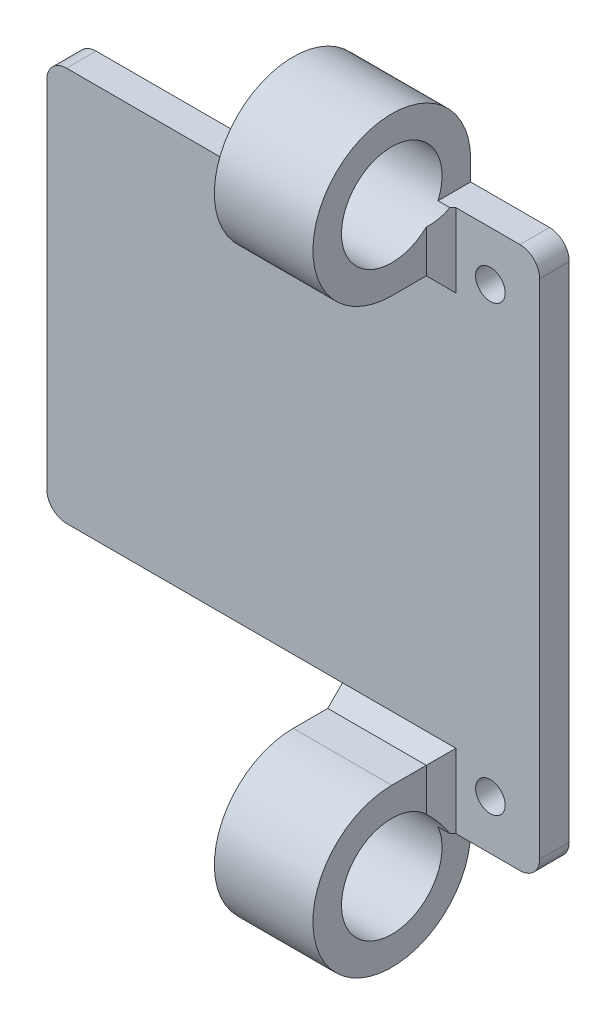
ISO-10303-21;
HEADER;
FILE_DESCRIPTION(('STEP AP214'),'2;1');
FILE_NAME('part.step','',(''),(''),'','','');
FILE_SCHEMA(('AUTOMOTIVE_DESIGN { 1 0 10303 214 1 1 1 1 }'));
ENDSEC;
DATA;
#1=APPLICATION_CONTEXT('core data for automotive mechanical design processes');
#2=APPLICATION_PROTOCOL_DEFINITION('international standard','automotive_design',2000,#1);
#3=PRODUCT_CONTEXT('',#1,'mechanical');
#4=PRODUCT('Part','Part','',(#3));
#5=PRODUCT_RELATED_PRODUCT_CATEGORY('part','',(#4));
#6=PRODUCT_DEFINITION_FORMATION('','',#4);
#7=PRODUCT_DEFINITION_CONTEXT('part definition',#1,'design');
#8=PRODUCT_DEFINITION('design','',#6,#7);
#9=PRODUCT_DEFINITION_SHAPE('','',#8);
#10=(LENGTH_UNIT() NAMED_UNIT(*) SI_UNIT(.MILLI.,.METRE.));
#11=(NAMED_UNIT(*) PLANE_ANGLE_UNIT() SI_UNIT($,.RADIAN.));
#12=(NAMED_UNIT(*) SI_UNIT($,.STERADIAN.) SOLID_ANGLE_UNIT());
#13=UNCERTAINTY_MEASURE_WITH_UNIT(LENGTH_MEASURE(1.E-05),#10,'distance_accuracy_value','');
#14=(GEOMETRIC_REPRESENTATION_CONTEXT(3) GLOBAL_UNCERTAINTY_ASSIGNED_CONTEXT((#13)) GLOBAL_UNIT_ASSIGNED_CONTEXT((#10,
#11,#12)) REPRESENTATION_CONTEXT('',''));
#15=CARTESIAN_POINT('',(0.,0.,0.));
#16=DIRECTION('',(0.,0.,1.));
#17=DIRECTION('',(1.,0.,0.));
#18=AXIS2_PLACEMENT_3D('',#15,#16,#17);
#19=CARTESIAN_POINT('',(-4.99999999999998,27.5,3.));
#20=DIRECTION('',(0.,-1.,0.));
#21=DIRECTION('',(1.,0.,0.));
#22=AXIS2_PLACEMENT_3D('',#19,#20,#21);
#23=PLANE('',#22);
#24=DIRECTION('',(-1.,0.,0.));
#25=VECTOR('',#24,1.);
#26=CARTESIAN_POINT('',(-4.99999999999998,27.5,0.));
#27=LINE('',#26,#25);
#28=CARTESIAN_POINT('',(5.,27.5,0.));
#29=VERTEX_POINT('',#28);
#30=CARTESIAN_POINT('',(-2.99999999999996,27.5,0.));
#31=VERTEX_POINT('',#30);
#32=EDGE_CURVE('E326',#29,#31,#27,.T.);
#33=ORIENTED_EDGE('',*,*,#32,.T.);
#34=DIRECTION('',(0.,0.,1.));
#35=VECTOR('',#34,1.);
#36=CARTESIAN_POINT('',(-2.99999999999996,27.5,3.));
#37=LINE('',#36,#35);
#38=CARTESIAN_POINT('',(-2.99999999999996,27.5,3.));
#39=VERTEX_POINT('',#38);
#40=EDGE_CURVE('E398',#31,#39,#37,.T.);
#41=ORIENTED_EDGE('',*,*,#40,.T.);
#42=DIRECTION('',(-1.,0.,0.));
#43=VECTOR('',#42,1.);
#44=CARTESIAN_POINT('',(-4.99999999999998,27.5,3.));
#45=LINE('',#44,#43);
#46=CARTESIAN_POINT('',(3.49999999999998,27.5,3.));
#47=VERTEX_POINT('',#46);
#48=EDGE_CURVE('E305',#47,#39,#45,.T.);
#49=ORIENTED_EDGE('',*,*,#48,.F.);
#50=DIRECTION('',(-0.707106781186551,0.,-0.707106781186544));
#51=VECTOR('',#50,1.);
#52=CARTESIAN_POINT('',(-0.750000000000036,27.5,-1.24999999999998));
#53=LINE('',#52,#51);
#54=CARTESIAN_POINT('',(3.80851835770403,27.5,3.30851835770404));
#55=VERTEX_POINT('',#54);
#56=EDGE_CURVE('E57',#47,#55,#53,.F.);
#57=ORIENTED_EDGE('',*,*,#56,.T.);
#58=DIRECTION('',(-1.,0.,0.));
#59=VECTOR('',#58,1.);
#60=CARTESIAN_POINT('',(5.,27.5,3.30851835770404));
#61=LINE('',#60,#59);
#62=CARTESIAN_POINT('',(5.,27.5,3.30851835770404));
#63=VERTEX_POINT('',#62);
#64=EDGE_CURVE('E42',#63,#55,#61,.T.);
#65=ORIENTED_EDGE('',*,*,#64,.F.);
#66=DIRECTION('',(0.,0.,1.));
#67=VECTOR('',#66,1.);
#68=CARTESIAN_POINT('',(5.,27.5,3.));
#69=LINE('',#68,#67);
#70=EDGE_CURVE('E385',#29,#63,#69,.T.);
#71=ORIENTED_EDGE('',*,*,#70,.F.);
#72=EDGE_LOOP('',(#33,#41,#49,#57,#65,#71));
#73=FACE_BOUND('',#72,.T.);
#74=ADVANCED_FACE('F33',(#73),#23,.F.);
#75=CARTESIAN_POINT('',(-25.,-20.,3.));
#76=DIRECTION('',(0.,1.,0.));
#77=DIRECTION('',(-1.,0.,0.));
#78=AXIS2_PLACEMENT_3D('',#75,#76,#77);
#79=PLANE('',#78);
#80=DIRECTION('',(0.,0.,-1.));
#81=VECTOR('',#80,1.);
#82=CARTESIAN_POINT('',(5.,-20.,3.));
#83=LINE('',#82,#81);
#84=CARTESIAN_POINT('',(5.,-20.,3.));
#85=VERTEX_POINT('',#84);
#86=CARTESIAN_POINT('',(5.,-20.,0.));
#87=VERTEX_POINT('',#86);
#88=EDGE_CURVE('E383',#85,#87,#83,.T.);
#89=ORIENTED_EDGE('',*,*,#88,.F.);
#90=DIRECTION('',(1.,0.,0.));
#91=VECTOR('',#90,1.);
#92=CARTESIAN_POINT('',(-25.,-20.,3.));
#93=LINE('',#92,#91);
#94=CARTESIAN_POINT('',(-23.,-20.,3.));
#95=VERTEX_POINT('',#94);
#96=EDGE_CURVE('E318',#95,#85,#93,.T.);
#97=ORIENTED_EDGE('',*,*,#96,.F.);
#98=DIRECTION('',(0.,0.,-1.));
#99=VECTOR('',#98,1.);
#100=CARTESIAN_POINT('',(-23.,-20.,3.));
#101=LINE('',#100,#99);
#102=CARTESIAN_POINT('',(-23.,-20.,0.));
#103=VERTEX_POINT('',#102);
#104=EDGE_CURVE('E369',#95,#103,#101,.T.);
#105=ORIENTED_EDGE('',*,*,#104,.T.);
#106=DIRECTION('',(1.,0.,0.));
#107=VECTOR('',#106,1.);
#108=CARTESIAN_POINT('',(-25.,-20.,0.));
#109=LINE('',#108,#107);
#110=EDGE_CURVE('E337',#103,#87,#109,.T.);
#111=ORIENTED_EDGE('',*,*,#110,.T.);
#112=EDGE_LOOP('',(#89,#97,#105,#111));
#113=FACE_BOUND('',#112,.T.);
#114=ADVANCED_FACE('F502',(#113),#79,.F.);
#115=CARTESIAN_POINT('',(0.,0.,3.));
#116=DIRECTION('',(0.,0.,-1.));
#117=DIRECTION('',(-1.,0.,0.));
#118=AXIS2_PLACEMENT_3D('',#115,#116,#117);
#119=PLANE('',#118);
#120=DIRECTION('',(1.,0.,0.));
#121=VECTOR('',#120,1.);
#122=CARTESIAN_POINT('',(0.,-20.,3.));
#123=LINE('',#122,#121);
#124=CARTESIAN_POINT('',(16.5,-20.,3.));
#125=VERTEX_POINT('',#124);
#126=EDGE_CURVE('E414',#85,#125,#123,.T.);
#127=ORIENTED_EDGE('',*,*,#126,.T.);
#128=DIRECTION('',(0.,-1.,0.));
#129=VECTOR('',#128,1.);
#130=CARTESIAN_POINT('',(16.5,0.,3.));
#131=LINE('',#130,#129);
#132=CARTESIAN_POINT('',(16.5,-27.5,3.));
#133=VERTEX_POINT('',#132);
#134=EDGE_CURVE('E416',#125,#133,#131,.T.);
#135=ORIENTED_EDGE('',*,*,#134,.T.);
#136=DIRECTION('',(1.,0.,0.));
#137=VECTOR('',#136,1.);
#138=CARTESIAN_POINT('',(9.99999999999999,-27.5,3.));
#139=LINE('',#138,#137);
#140=CARTESIAN_POINT('',(23.,-27.5,3.));
#141=VERTEX_POINT('',#140);
#142=EDGE_CURVE('E321',#133,#141,#139,.T.);
#143=ORIENTED_EDGE('',*,*,#142,.T.);
#144=CARTESIAN_POINT('',(23.,-25.5,3.));
#145=DIRECTION('',(0.,0.,-1.));
#146=DIRECTION('',(-1.,0.,0.));
#147=AXIS2_PLACEMENT_3D('',#144,#145,#146);
#148=CIRCLE('',#147,2.);
#149=CARTESIAN_POINT('',(25.,-25.5,3.));
#150=VERTEX_POINT('',#149);
#151=EDGE_CURVE('E362',#141,#150,#148,.F.);
#152=ORIENTED_EDGE('',*,*,#151,.T.);
#153=DIRECTION('',(0.,1.,0.));
#154=VECTOR('',#153,1.);
#155=CARTESIAN_POINT('',(25.,-27.5,3.));
#156=LINE('',#155,#154);
#157=CARTESIAN_POINT('',(25.,25.5,3.));
#158=VERTEX_POINT('',#157);
#159=EDGE_CURVE('E302',#150,#158,#156,.T.);
#160=ORIENTED_EDGE('',*,*,#159,.T.);
#161=CARTESIAN_POINT('',(23.,25.5,3.));
#162=DIRECTION('',(0.,0.,-1.));
#163=DIRECTION('',(-1.,0.,0.));
#164=AXIS2_PLACEMENT_3D('',#161,#162,#163);
#165=CIRCLE('',#164,2.);
#166=CARTESIAN_POINT('',(23.,27.5,3.));
#167=VERTEX_POINT('',#166);
#168=EDGE_CURVE('E364',#158,#167,#165,.F.);
#169=ORIENTED_EDGE('',*,*,#168,.T.);
#170=CARTESIAN_POINT('',(16.5,27.5,3.));
#171=VERTEX_POINT('',#170);
#172=EDGE_CURVE('E307',#167,#171,#45,.T.);
#173=ORIENTED_EDGE('',*,*,#172,.T.);
#174=DIRECTION('',(0.,-1.,0.));
#175=VECTOR('',#174,1.);
#176=CARTESIAN_POINT('',(16.5,0.,3.));
#177=LINE('',#176,#175);
#178=CARTESIAN_POINT('',(16.5,20.,3.));
#179=VERTEX_POINT('',#178);
#180=EDGE_CURVE('E411',#171,#179,#177,.T.);
#181=ORIENTED_EDGE('',*,*,#180,.T.);
#182=DIRECTION('',(-1.,0.,0.));
#183=VECTOR('',#182,1.);
#184=CARTESIAN_POINT('',(5.,20.,3.));
#185=LINE('',#184,#183);
#186=CARTESIAN_POINT('',(3.49999999999998,20.,3.));
#187=VERTEX_POINT('',#186);
#188=EDGE_CURVE('E407',#179,#187,#185,.T.);
#189=ORIENTED_EDGE('',*,*,#188,.T.);
#190=DIRECTION('',(0.,1.,0.));
#191=VECTOR('',#190,1.);
#192=CARTESIAN_POINT('',(3.49999999999998,27.5,3.));
#193=LINE('',#192,#191);
#194=EDGE_CURVE('E409',#187,#47,#193,.T.);
#195=ORIENTED_EDGE('',*,*,#194,.T.);
#196=ORIENTED_EDGE('',*,*,#48,.T.);
#197=DIRECTION('',(0.70710678118655,0.707106781186545,0.));
#198=VECTOR('',#197,1.);
#199=CARTESIAN_POINT('',(-4.99999999999998,25.5,3.));
#200=LINE('',#199,#198);
#201=CARTESIAN_POINT('',(-4.99999999999998,25.5,3.));
#202=VERTEX_POINT('',#201);
#203=EDGE_CURVE('E401',#39,#202,#200,.F.);
#204=ORIENTED_EDGE('',*,*,#203,.T.);
#205=DIRECTION('',(0.,-1.,0.));
#206=VECTOR('',#205,1.);
#207=CARTESIAN_POINT('',(-4.99999999999998,27.5,3.));
#208=LINE('',#207,#206);
#209=CARTESIAN_POINT('',(-4.99999999999998,22.,3.));
#210=VERTEX_POINT('',#209);
#211=EDGE_CURVE('E310',#202,#210,#208,.T.);
#212=ORIENTED_EDGE('',*,*,#211,.T.);
#213=DIRECTION('',(0.707106781186552,0.707106781186543,0.));
#214=VECTOR('',#213,1.);
#215=CARTESIAN_POINT('',(-13.4999999999999,13.5000000000001,3.));
#216=LINE('',#215,#214);
#217=CARTESIAN_POINT('',(-6.99999999999998,20.,3.));
#218=VERTEX_POINT('',#217);
#219=EDGE_CURVE('E405',#210,#218,#216,.F.);
#220=ORIENTED_EDGE('',*,*,#219,.T.);
#221=DIRECTION('',(-1.,0.,0.));
#222=VECTOR('',#221,1.);
#223=CARTESIAN_POINT('',(-4.99999999999998,20.,3.));
#224=LINE('',#223,#222);
#225=CARTESIAN_POINT('',(-23.,20.,3.));
#226=VERTEX_POINT('',#225);
#227=EDGE_CURVE('E313',#218,#226,#224,.T.);
#228=ORIENTED_EDGE('',*,*,#227,.T.);
#229=CARTESIAN_POINT('',(-23.,18.,3.));
#230=DIRECTION('',(0.,0.,-1.));
#231=DIRECTION('',(-1.,0.,0.));
#232=AXIS2_PLACEMENT_3D('',#229,#230,#231);
#233=CIRCLE('',#232,2.);
#234=CARTESIAN_POINT('',(-25.,18.,3.));
#235=VERTEX_POINT('',#234);
#236=EDGE_CURVE('E358',#226,#235,#233,.F.);
#237=ORIENTED_EDGE('',*,*,#236,.T.);
#238=DIRECTION('',(0.,-1.,0.));
#239=VECTOR('',#238,1.);
#240=CARTESIAN_POINT('',(-25.,-20.,3.));
#241=LINE('',#240,#239);
#242=CARTESIAN_POINT('',(-25.,-18.,3.));
#243=VERTEX_POINT('',#242);
#244=EDGE_CURVE('E315',#235,#243,#241,.T.);
#245=ORIENTED_EDGE('',*,*,#244,.T.);
#246=CARTESIAN_POINT('',(-23.,-18.,3.));
#247=DIRECTION('',(0.,0.,-1.));
#248=DIRECTION('',(-1.,0.,0.));
#249=AXIS2_PLACEMENT_3D('',#246,#247,#248);
#250=CIRCLE('',#249,2.);
#251=EDGE_CURVE('E360',#243,#95,#250,.F.);
#252=ORIENTED_EDGE('',*,*,#251,.T.);
#253=ORIENTED_EDGE('',*,*,#96,.T.);
#254=EDGE_LOOP('',(#127,#135,#143,#152,#160,#169,#173,#181,#189,#195,#196,#204,#212,#220,#228,
#237,#245,#252,#253));
#255=FACE_BOUND('',#254,.T.);
#256=CARTESIAN_POINT('',(20.,-22.5,3.));
#257=DIRECTION('',(0.,0.,1.));
#258=DIRECTION('',(1.,0.,0.));
#259=AXIS2_PLACEMENT_3D('',#256,#257,#258);
#260=CIRCLE('',#259,1.5);
#261=CARTESIAN_POINT('',(21.5,-22.5,3.));
#262=VERTEX_POINT('',#261);
#263=EDGE_CURVE('E284',#262,#262,#260,.T.);
#264=ORIENTED_EDGE('',*,*,#263,.F.);
#265=EDGE_LOOP('',(#264));
#266=FACE_BOUND('',#265,.T.);
#267=CARTESIAN_POINT('',(20.,22.5,3.));
#268=DIRECTION('',(0.,0.,1.));
#269=DIRECTION('',(1.,0.,0.));
#270=AXIS2_PLACEMENT_3D('',#267,#268,#269);
#271=CIRCLE('',#270,1.5);
#272=CARTESIAN_POINT('',(21.5,22.5,3.));
#273=VERTEX_POINT('',#272);
#274=EDGE_CURVE('E290',#273,#273,#271,.T.);
#275=ORIENTED_EDGE('',*,*,#274,.F.);
#276=EDGE_LOOP('',(#275));
#277=FACE_BOUND('',#276,.T.);
#278=CARTESIAN_POINT('',(0.,22.5,3.));
#279=DIRECTION('',(0.,0.,1.));
#280=DIRECTION('',(1.,0.,0.));
#281=AXIS2_PLACEMENT_3D('',#278,#279,#280);
#282=CIRCLE('',#281,1.5);
#283=CARTESIAN_POINT('',(1.50000000000001,22.5,3.));
#284=VERTEX_POINT('',#283);
#285=EDGE_CURVE('E296',#284,#284,#282,.T.);
#286=ORIENTED_EDGE('',*,*,#285,.F.);
#287=EDGE_LOOP('',(#286));
#288=FACE_BOUND('',#287,.T.);
#289=ADVANCED_FACE('F464',(#255,#266,#277,#288),#119,.F.);
#290=CARTESIAN_POINT('',(0.,0.,0.));
#291=DIRECTION('',(0.,0.,-1.));
#292=DIRECTION('',(-1.,0.,0.));
#293=AXIS2_PLACEMENT_3D('',#290,#291,#292);
#294=PLANE('',#293);
#295=DIRECTION('',(0.,-1.,0.));
#296=VECTOR('',#295,1.);
#297=CARTESIAN_POINT('',(-4.99999999999998,27.5,0.));
#298=LINE('',#297,#296);
#299=CARTESIAN_POINT('',(-4.99999999999998,25.5,0.));
#300=VERTEX_POINT('',#299);
#301=CARTESIAN_POINT('',(-4.99999999999998,22.,0.));
#302=VERTEX_POINT('',#301);
#303=EDGE_CURVE('E329',#300,#302,#298,.T.);
#304=ORIENTED_EDGE('',*,*,#303,.F.);
#305=DIRECTION('',(-0.70710678118655,-0.707106781186545,0.));
#306=VECTOR('',#305,1.);
#307=CARTESIAN_POINT('',(-15.25,15.2500000000001,0.));
#308=LINE('',#307,#306);
#309=EDGE_CURVE('E396',#300,#31,#308,.F.);
#310=ORIENTED_EDGE('',*,*,#309,.T.);
#311=ORIENTED_EDGE('',*,*,#32,.F.);
#312=DIRECTION('',(0.,1.,0.));
#313=VECTOR('',#312,1.);
#314=CARTESIAN_POINT('',(5.,0.,0.));
#315=LINE('',#314,#313);
#316=CARTESIAN_POINT('',(5.,29.5,0.));
#317=VERTEX_POINT('',#316);
#318=EDGE_CURVE('E250',#29,#317,#315,.T.);
#319=ORIENTED_EDGE('',*,*,#318,.T.);
#320=DIRECTION('',(-1.,0.,0.));
#321=VECTOR('',#320,1.);
#322=CARTESIAN_POINT('',(15.,29.5,0.));
#323=LINE('',#322,#321);
#324=CARTESIAN_POINT('',(15.,29.5,0.));
#325=VERTEX_POINT('',#324);
#326=EDGE_CURVE('E239',#325,#317,#323,.T.);
#327=ORIENTED_EDGE('',*,*,#326,.F.);
#328=DIRECTION('',(0.,1.,0.));
#329=VECTOR('',#328,1.);
#330=CARTESIAN_POINT('',(15.,0.,0.));
#331=LINE('',#330,#329);
#332=CARTESIAN_POINT('',(15.,27.5,0.));
#333=VERTEX_POINT('',#332);
#334=EDGE_CURVE('E223',#333,#325,#331,.T.);
#335=ORIENTED_EDGE('',*,*,#334,.F.);
#336=CARTESIAN_POINT('',(23.,27.5,0.));
#337=VERTEX_POINT('',#336);
#338=EDGE_CURVE('E327',#337,#333,#27,.T.);
#339=ORIENTED_EDGE('',*,*,#338,.F.);
#340=CARTESIAN_POINT('',(23.,25.5,0.));
#341=DIRECTION('',(0.,0.,-1.));
#342=DIRECTION('',(-1.,0.,0.));
#343=AXIS2_PLACEMENT_3D('',#340,#341,#342);
#344=CIRCLE('',#343,2.);
#345=CARTESIAN_POINT('',(25.,25.5,0.));
#346=VERTEX_POINT('',#345);
#347=EDGE_CURVE('E351',#337,#346,#344,.T.);
#348=ORIENTED_EDGE('',*,*,#347,.T.);
#349=DIRECTION('',(0.,1.,0.));
#350=VECTOR('',#349,1.);
#351=CARTESIAN_POINT('',(25.,-27.5,0.));
#352=LINE('',#351,#350);
#353=CARTESIAN_POINT('',(25.,-25.5,0.));
#354=VERTEX_POINT('',#353);
#355=EDGE_CURVE('E299',#354,#346,#352,.T.);
#356=ORIENTED_EDGE('',*,*,#355,.F.);
#357=CARTESIAN_POINT('',(23.,-25.5,0.));
#358=DIRECTION('',(0.,0.,-1.));
#359=DIRECTION('',(-1.,0.,0.));
#360=AXIS2_PLACEMENT_3D('',#357,#358,#359);
#361=CIRCLE('',#360,2.);
#362=CARTESIAN_POINT('',(23.,-27.5,0.));
#363=VERTEX_POINT('',#362);
#364=EDGE_CURVE('E348',#354,#363,#361,.T.);
#365=ORIENTED_EDGE('',*,*,#364,.T.);
#366=DIRECTION('',(1.,0.,0.));
#367=VECTOR('',#366,1.);
#368=CARTESIAN_POINT('',(9.99999999999999,-27.5,0.));
#369=LINE('',#368,#367);
#370=CARTESIAN_POINT('',(15.,-27.5,0.));
#371=VERTEX_POINT('',#370);
#372=EDGE_CURVE('E306',#371,#363,#369,.T.);
#373=ORIENTED_EDGE('',*,*,#372,.F.);
#374=DIRECTION('',(0.,-1.,0.));
#375=VECTOR('',#374,1.);
#376=CARTESIAN_POINT('',(15.,0.,0.));
#377=LINE('',#376,#375);
#378=CARTESIAN_POINT('',(15.,-29.5,0.));
#379=VERTEX_POINT('',#378);
#380=EDGE_CURVE('E263',#371,#379,#377,.T.);
#381=ORIENTED_EDGE('',*,*,#380,.T.);
#382=DIRECTION('',(-1.,0.,0.));
#383=VECTOR('',#382,1.);
#384=CARTESIAN_POINT('',(15.,-29.5,0.));
#385=LINE('',#384,#383);
#386=CARTESIAN_POINT('',(5.,-29.5,0.));
#387=VERTEX_POINT('',#386);
#388=EDGE_CURVE('E280',#379,#387,#385,.T.);
#389=ORIENTED_EDGE('',*,*,#388,.T.);
#390=DIRECTION('',(0.,-1.,0.));
#391=VECTOR('',#390,1.);
#392=CARTESIAN_POINT('',(5.,0.,0.));
#393=LINE('',#392,#391);
#394=EDGE_CURVE('E255',#87,#387,#393,.T.);
#395=ORIENTED_EDGE('',*,*,#394,.F.);
#396=ORIENTED_EDGE('',*,*,#110,.F.);
#397=CARTESIAN_POINT('',(-23.,-18.,0.));
#398=DIRECTION('',(0.,0.,-1.));
#399=DIRECTION('',(-1.,0.,0.));
#400=AXIS2_PLACEMENT_3D('',#397,#398,#399);
#401=CIRCLE('',#400,2.);
#402=CARTESIAN_POINT('',(-25.,-18.,0.));
#403=VERTEX_POINT('',#402);
#404=EDGE_CURVE('E346',#103,#403,#401,.T.);
#405=ORIENTED_EDGE('',*,*,#404,.T.);
#406=DIRECTION('',(0.,-1.,0.));
#407=VECTOR('',#406,1.);
#408=CARTESIAN_POINT('',(-25.,-20.,0.));
#409=LINE('',#408,#407);
#410=CARTESIAN_POINT('',(-25.,18.,0.));
#411=VERTEX_POINT('',#410);
#412=EDGE_CURVE('E334',#411,#403,#409,.T.);
#413=ORIENTED_EDGE('',*,*,#412,.F.);
#414=CARTESIAN_POINT('',(-23.,18.,0.));
#415=DIRECTION('',(0.,0.,-1.));
#416=DIRECTION('',(-1.,0.,0.));
#417=AXIS2_PLACEMENT_3D('',#414,#415,#416);
#418=CIRCLE('',#417,2.);
#419=CARTESIAN_POINT('',(-23.,20.,0.));
#420=VERTEX_POINT('',#419);
#421=EDGE_CURVE('E343',#411,#420,#418,.T.);
#422=ORIENTED_EDGE('',*,*,#421,.T.);
#423=DIRECTION('',(-1.,0.,0.));
#424=VECTOR('',#423,1.);
#425=CARTESIAN_POINT('',(-4.99999999999998,20.,0.));
#426=LINE('',#425,#424);
#427=CARTESIAN_POINT('',(-6.99999999999998,20.,0.));
#428=VERTEX_POINT('',#427);
#429=EDGE_CURVE('E332',#428,#420,#426,.T.);
#430=ORIENTED_EDGE('',*,*,#429,.F.);
#431=DIRECTION('',(-0.707106781186552,-0.707106781186543,0.));
#432=VECTOR('',#431,1.);
#433=CARTESIAN_POINT('',(-6.99999999999998,20.,0.));
#434=LINE('',#433,#432);
#435=EDGE_CURVE('E403',#428,#302,#434,.F.);
#436=ORIENTED_EDGE('',*,*,#435,.T.);
#437=EDGE_LOOP('',(#304,#310,#311,#319,#327,#335,#339,#348,#356,#365,#373,#381,#389,#395,#396,
#405,#413,#422,#430,#436));
#438=FACE_BOUND('',#437,.T.);
#439=CARTESIAN_POINT('',(20.,22.5,0.));
#440=DIRECTION('',(0.,0.,1.));
#441=DIRECTION('',(1.,0.,0.));
#442=AXIS2_PLACEMENT_3D('',#439,#440,#441);
#443=CIRCLE('',#442,1.5);
#444=CARTESIAN_POINT('',(21.5,22.5,0.));
#445=VERTEX_POINT('',#444);
#446=EDGE_CURVE('E287',#445,#445,#443,.T.);
#447=ORIENTED_EDGE('',*,*,#446,.T.);
#448=EDGE_LOOP('',(#447));
#449=FACE_BOUND('',#448,.T.);
#450=CARTESIAN_POINT('',(0.,22.5,0.));
#451=DIRECTION('',(0.,0.,1.));
#452=DIRECTION('',(1.,0.,0.));
#453=AXIS2_PLACEMENT_3D('',#450,#451,#452);
#454=CIRCLE('',#453,1.5);
#455=CARTESIAN_POINT('',(1.50000000000001,22.5,0.));
#456=VERTEX_POINT('',#455);
#457=EDGE_CURVE('E293',#456,#456,#454,.T.);
#458=ORIENTED_EDGE('',*,*,#457,.T.);
#459=EDGE_LOOP('',(#458));
#460=FACE_BOUND('',#459,.T.);
#461=CARTESIAN_POINT('',(20.,-22.5,0.));
#462=DIRECTION('',(0.,0.,1.));
#463=DIRECTION('',(1.,0.,0.));
#464=AXIS2_PLACEMENT_3D('',#461,#462,#463);
#465=CIRCLE('',#464,1.5);
#466=CARTESIAN_POINT('',(21.5,-22.5,0.));
#467=VERTEX_POINT('',#466);
#468=EDGE_CURVE('E283',#467,#467,#465,.T.);
#469=ORIENTED_EDGE('',*,*,#468,.T.);
#470=EDGE_LOOP('',(#469));
#471=FACE_BOUND('',#470,.T.);
#472=ADVANCED_FACE('F246',(#438,#449,#460,#471),#294,.T.);
#473=CARTESIAN_POINT('',(25.,-27.5,3.));
#474=DIRECTION('',(-1.,0.,0.));
#475=DIRECTION('',(0.,0.,1.));
#476=AXIS2_PLACEMENT_3D('',#473,#474,#475);
#477=PLANE('',#476);
#478=ORIENTED_EDGE('',*,*,#355,.T.);
#479=DIRECTION('',(0.,0.,-1.));
#480=VECTOR('',#479,1.);
#481=CARTESIAN_POINT('',(25.,25.5,3.));
#482=LINE('',#481,#480);
#483=EDGE_CURVE('E356',#346,#158,#482,.F.);
#484=ORIENTED_EDGE('',*,*,#483,.T.);
#485=ORIENTED_EDGE('',*,*,#159,.F.);
#486=DIRECTION('',(0.,0.,-1.));
#487=VECTOR('',#486,1.);
#488=CARTESIAN_POINT('',(25.,-25.5,3.));
#489=LINE('',#488,#487);
#490=EDGE_CURVE('E353',#150,#354,#489,.T.);
#491=ORIENTED_EDGE('',*,*,#490,.T.);
#492=EDGE_LOOP('',(#478,#484,#485,#491));
#493=FACE_BOUND('',#492,.T.);
#494=ADVANCED_FACE('F539',(#493),#477,.F.);
#495=ORIENTED_EDGE('',*,*,#338,.T.);
#496=DIRECTION('',(0.,0.,1.));
#497=VECTOR('',#496,1.);
#498=CARTESIAN_POINT('',(15.,27.5,3.));
#499=LINE('',#498,#497);
#500=CARTESIAN_POINT('',(15.,27.5,3.30851835770404));
#501=VERTEX_POINT('',#500);
#502=EDGE_CURVE('E230',#333,#501,#499,.T.);
#503=ORIENTED_EDGE('',*,*,#502,.T.);
#504=DIRECTION('',(-1.,0.,0.));
#505=VECTOR('',#504,1.);
#506=CARTESIAN_POINT('',(16.191481642296,27.5,3.30851835770404));
#507=LINE('',#506,#505);
#508=CARTESIAN_POINT('',(16.191481642296,27.5,3.30851835770404));
#509=VERTEX_POINT('',#508);
#510=EDGE_CURVE('E11',#501,#509,#507,.F.);
#511=ORIENTED_EDGE('',*,*,#510,.T.);
#512=DIRECTION('',(0.707106781186551,0.,-0.707106781186544));
#513=VECTOR('',#512,1.);
#514=CARTESIAN_POINT('',(5.74999999999992,27.5,13.75));
#515=LINE('',#514,#513);
#516=EDGE_CURVE('E436',#509,#171,#515,.T.);
#517=ORIENTED_EDGE('',*,*,#516,.T.);
#518=ORIENTED_EDGE('',*,*,#172,.F.);
#519=DIRECTION('',(0.,0.,-1.));
#520=VECTOR('',#519,1.);
#521=CARTESIAN_POINT('',(23.,27.5,3.));
#522=LINE('',#521,#520);
#523=EDGE_CURVE('E323',#167,#337,#522,.T.);
#524=ORIENTED_EDGE('',*,*,#523,.T.);
#525=EDGE_LOOP('',(#495,#503,#511,#517,#518,#524));
#526=FACE_BOUND('',#525,.T.);
#527=ADVANCED_FACE('F547',(#526),#23,.F.);
#528=CARTESIAN_POINT('',(-4.99999999999998,27.5,3.));
#529=DIRECTION('',(1.,0.,0.));
#530=DIRECTION('',(0.,1.,0.));
#531=AXIS2_PLACEMENT_3D('',#528,#529,#530);
#532=PLANE('',#531);
#533=ORIENTED_EDGE('',*,*,#303,.T.);
#534=DIRECTION('',(0.,0.,1.));
#535=VECTOR('',#534,1.);
#536=CARTESIAN_POINT('',(-4.99999999999998,22.,3.));
#537=LINE('',#536,#535);
#538=EDGE_CURVE('E394',#302,#210,#537,.T.);
#539=ORIENTED_EDGE('',*,*,#538,.T.);
#540=ORIENTED_EDGE('',*,*,#211,.F.);
#541=DIRECTION('',(0.,0.,-1.));
#542=VECTOR('',#541,1.);
#543=CARTESIAN_POINT('',(-4.99999999999998,25.5,3.));
#544=LINE('',#543,#542);
#545=EDGE_CURVE('E391',#202,#300,#544,.T.);
#546=ORIENTED_EDGE('',*,*,#545,.T.);
#547=EDGE_LOOP('',(#533,#539,#540,#546));
#548=FACE_BOUND('',#547,.T.);
#549=ADVANCED_FACE('F475',(#548),#532,.F.);
#550=CARTESIAN_POINT('',(-4.99999999999998,20.,3.));
#551=DIRECTION('',(0.,-1.,0.));
#552=DIRECTION('',(1.,0.,0.));
#553=AXIS2_PLACEMENT_3D('',#550,#551,#552);
#554=PLANE('',#553);
#555=ORIENTED_EDGE('',*,*,#227,.F.);
#556=DIRECTION('',(0.,0.,-1.));
#557=VECTOR('',#556,1.);
#558=CARTESIAN_POINT('',(-6.99999999999998,20.,0.));
#559=LINE('',#558,#557);
#560=EDGE_CURVE('E388',#218,#428,#559,.T.);
#561=ORIENTED_EDGE('',*,*,#560,.T.);
#562=ORIENTED_EDGE('',*,*,#429,.T.);
#563=DIRECTION('',(0.,0.,-1.));
#564=VECTOR('',#563,1.);
#565=CARTESIAN_POINT('',(-23.,20.,3.));
#566=LINE('',#565,#564);
#567=EDGE_CURVE('E377',#420,#226,#566,.F.);
#568=ORIENTED_EDGE('',*,*,#567,.T.);
#569=EDGE_LOOP('',(#555,#561,#562,#568));
#570=FACE_BOUND('',#569,.T.);
#571=ADVANCED_FACE('F482',(#570),#554,.F.);
#572=CARTESIAN_POINT('',(-25.,-20.,3.));
#573=DIRECTION('',(1.,0.,0.));
#574=DIRECTION('',(0.,0.,-1.));
#575=AXIS2_PLACEMENT_3D('',#572,#573,#574);
#576=PLANE('',#575);
#577=ORIENTED_EDGE('',*,*,#412,.T.);
#578=DIRECTION('',(0.,0.,-1.));
#579=VECTOR('',#578,1.);
#580=CARTESIAN_POINT('',(-25.,-18.,3.));
#581=LINE('',#580,#579);
#582=EDGE_CURVE('E375',#403,#243,#581,.F.);
#583=ORIENTED_EDGE('',*,*,#582,.T.);
#584=ORIENTED_EDGE('',*,*,#244,.F.);
#585=DIRECTION('',(0.,0.,-1.));
#586=VECTOR('',#585,1.);
#587=CARTESIAN_POINT('',(-25.,18.,3.));
#588=LINE('',#587,#586);
#589=EDGE_CURVE('E372',#235,#411,#588,.T.);
#590=ORIENTED_EDGE('',*,*,#589,.T.);
#591=EDGE_LOOP('',(#577,#583,#584,#590));
#592=FACE_BOUND('',#591,.T.);
#593=ADVANCED_FACE('F492',(#592),#576,.F.);
#594=CARTESIAN_POINT('',(9.99999999999999,-27.5,3.));
#595=DIRECTION('',(0.,1.,0.));
#596=DIRECTION('',(0.,0.,1.));
#597=AXIS2_PLACEMENT_3D('',#594,#595,#596);
#598=PLANE('',#597);
#599=ORIENTED_EDGE('',*,*,#142,.F.);
#600=DIRECTION('',(-0.707106781186544,0.,0.707106781186551));
#601=VECTOR('',#600,1.);
#602=CARTESIAN_POINT('',(13.25,-27.5,6.25));
#603=LINE('',#602,#601);
#604=CARTESIAN_POINT('',(16.191481642296,-27.5,3.30851835770404));
#605=VERTEX_POINT('',#604);
#606=EDGE_CURVE('E429',#133,#605,#603,.T.);
#607=ORIENTED_EDGE('',*,*,#606,.T.);
#608=DIRECTION('',(-1.,0.,0.));
#609=VECTOR('',#608,1.);
#610=CARTESIAN_POINT('',(15.,-27.5,3.30851835770404));
#611=LINE('',#610,#609);
#612=CARTESIAN_POINT('',(15.,-27.5,3.30851835770404));
#613=VERTEX_POINT('',#612);
#614=EDGE_CURVE('E441',#613,#605,#611,.F.);
#615=ORIENTED_EDGE('',*,*,#614,.F.);
#616=DIRECTION('',(0.,0.,-1.));
#617=VECTOR('',#616,1.);
#618=CARTESIAN_POINT('',(15.,-27.5,3.));
#619=LINE('',#618,#617);
#620=EDGE_CURVE('E380',#613,#371,#619,.T.);
#621=ORIENTED_EDGE('',*,*,#620,.T.);
#622=ORIENTED_EDGE('',*,*,#372,.T.);
#623=DIRECTION('',(0.,0.,-1.));
#624=VECTOR('',#623,1.);
#625=CARTESIAN_POINT('',(23.,-27.5,3.));
#626=LINE('',#625,#624);
#627=EDGE_CURVE('E366',#363,#141,#626,.F.);
#628=ORIENTED_EDGE('',*,*,#627,.T.);
#629=EDGE_LOOP('',(#599,#607,#615,#621,#622,#628));
#630=FACE_BOUND('',#629,.T.);
#631=ADVANCED_FACE('F529',(#630),#598,.F.);
#632=CARTESIAN_POINT('',(0.,22.5,3.));
#633=DIRECTION('',(0.,0.,-1.));
#634=DIRECTION('',(-1.,0.,0.));
#635=AXIS2_PLACEMENT_3D('',#632,#633,#634);
#636=CYLINDRICAL_SURFACE('',#635,1.5);
#637=ORIENTED_EDGE('',*,*,#285,.T.);
#638=EDGE_LOOP('',(#637));
#639=FACE_BOUND('',#638,.T.);
#640=ORIENTED_EDGE('',*,*,#457,.F.);
#641=EDGE_LOOP('',(#640));
#642=FACE_BOUND('',#641,.T.);
#643=ADVANCED_FACE('F742',(#639,#642),#636,.F.);
#644=CARTESIAN_POINT('',(20.,22.5,3.));
#645=DIRECTION('',(0.,0.,-1.));
#646=DIRECTION('',(-1.,0.,0.));
#647=AXIS2_PLACEMENT_3D('',#644,#645,#646);
#648=CYLINDRICAL_SURFACE('',#647,1.5);
#649=ORIENTED_EDGE('',*,*,#274,.T.);
#650=EDGE_LOOP('',(#649));
#651=FACE_BOUND('',#650,.T.);
#652=ORIENTED_EDGE('',*,*,#446,.F.);
#653=EDGE_LOOP('',(#652));
#654=FACE_BOUND('',#653,.T.);
#655=ADVANCED_FACE('F734',(#651,#654),#648,.F.);
#656=CARTESIAN_POINT('',(20.,-22.5,3.));
#657=DIRECTION('',(0.,0.,-1.));
#658=DIRECTION('',(-1.,0.,0.));
#659=AXIS2_PLACEMENT_3D('',#656,#657,#658);
#660=CYLINDRICAL_SURFACE('',#659,1.5);
#661=ORIENTED_EDGE('',*,*,#263,.T.);
#662=EDGE_LOOP('',(#661));
#663=FACE_BOUND('',#662,.T.);
#664=ORIENTED_EDGE('',*,*,#468,.F.);
#665=EDGE_LOOP('',(#664));
#666=FACE_BOUND('',#665,.T.);
#667=ADVANCED_FACE('F602',(#663,#666),#660,.F.);
#668=CARTESIAN_POINT('',(23.,25.5,3.));
#669=DIRECTION('',(0.,0.,-1.));
#670=DIRECTION('',(-1.,0.,0.));
#671=AXIS2_PLACEMENT_3D('',#668,#669,#670);
#672=CYLINDRICAL_SURFACE('',#671,2.);
#673=ORIENTED_EDGE('',*,*,#168,.F.);
#674=ORIENTED_EDGE('',*,*,#483,.F.);
#675=ORIENTED_EDGE('',*,*,#347,.F.);
#676=ORIENTED_EDGE('',*,*,#523,.F.);
#677=EDGE_LOOP('',(#673,#674,#675,#676));
#678=FACE_BOUND('',#677,.T.);
#679=ADVANCED_FACE('F543',(#678),#672,.T.);
#680=CARTESIAN_POINT('',(23.,-25.5,3.));
#681=DIRECTION('',(0.,0.,-1.));
#682=DIRECTION('',(-1.,0.,0.));
#683=AXIS2_PLACEMENT_3D('',#680,#681,#682);
#684=CYLINDRICAL_SURFACE('',#683,2.);
#685=ORIENTED_EDGE('',*,*,#151,.F.);
#686=ORIENTED_EDGE('',*,*,#627,.F.);
#687=ORIENTED_EDGE('',*,*,#364,.F.);
#688=ORIENTED_EDGE('',*,*,#490,.F.);
#689=EDGE_LOOP('',(#685,#686,#687,#688));
#690=FACE_BOUND('',#689,.T.);
#691=ADVANCED_FACE('F535',(#690),#684,.T.);
#692=CARTESIAN_POINT('',(-23.,-18.,3.));
#693=DIRECTION('',(0.,0.,-1.));
#694=DIRECTION('',(-1.,0.,0.));
#695=AXIS2_PLACEMENT_3D('',#692,#693,#694);
#696=CYLINDRICAL_SURFACE('',#695,2.);
#697=ORIENTED_EDGE('',*,*,#251,.F.);
#698=ORIENTED_EDGE('',*,*,#582,.F.);
#699=ORIENTED_EDGE('',*,*,#404,.F.);
#700=ORIENTED_EDGE('',*,*,#104,.F.);
#701=EDGE_LOOP('',(#697,#698,#699,#700));
#702=FACE_BOUND('',#701,.T.);
#703=ADVANCED_FACE('F496',(#702),#696,.T.);
#704=CARTESIAN_POINT('',(-23.,18.,3.));
#705=DIRECTION('',(0.,0.,-1.));
#706=DIRECTION('',(-1.,0.,0.));
#707=AXIS2_PLACEMENT_3D('',#704,#705,#706);
#708=CYLINDRICAL_SURFACE('',#707,2.);
#709=ORIENTED_EDGE('',*,*,#236,.F.);
#710=ORIENTED_EDGE('',*,*,#567,.F.);
#711=ORIENTED_EDGE('',*,*,#421,.F.);
#712=ORIENTED_EDGE('',*,*,#589,.F.);
#713=EDGE_LOOP('',(#709,#710,#711,#712));
#714=FACE_BOUND('',#713,.T.);
#715=ADVANCED_FACE('F488',(#714),#708,.T.);
#716=CARTESIAN_POINT('',(5.,0.,0.));
#717=DIRECTION('',(1.,0.,0.));
#718=DIRECTION('',(0.,0.,-1.));
#719=AXIS2_PLACEMENT_3D('',#716,#717,#718);
#720=PLANE('',#719);
#721=CARTESIAN_POINT('',(5.,-29.5,8.));
#722=DIRECTION('',(1.,0.,0.));
#723=DIRECTION('',(0.,0.,-1.));
#724=AXIS2_PLACEMENT_3D('',#721,#722,#723);
#725=CIRCLE('',#724,5.1);
#726=CARTESIAN_POINT('',(5.,-29.5,2.9));
#727=VERTEX_POINT('',#726);
#728=EDGE_CURVE('E264',#727,#727,#725,.F.);
#729=ORIENTED_EDGE('',*,*,#728,.F.);
#730=EDGE_LOOP('',(#729));
#731=FACE_BOUND('',#730,.T.);
#732=DIRECTION('',(0.,0.,-1.));
#733=VECTOR('',#732,1.);
#734=CARTESIAN_POINT('',(5.,-21.5,0.));
#735=LINE('',#734,#733);
#736=CARTESIAN_POINT('',(5.,-21.5,8.));
#737=VERTEX_POINT('',#736);
#738=CARTESIAN_POINT('',(5.,-21.5,4.50000000000002));
#739=VERTEX_POINT('',#738);
#740=EDGE_CURVE('E274',#737,#739,#735,.T.);
#741=ORIENTED_EDGE('',*,*,#740,.T.);
#742=DIRECTION('',(0.,0.707106781186544,-0.707106781186551));
#743=VECTOR('',#742,1.);
#744=CARTESIAN_POINT('',(5.,-8.50000000000009,-8.50000000000001));
#745=LINE('',#744,#743);
#746=EDGE_CURVE('E433',#739,#85,#745,.T.);
#747=ORIENTED_EDGE('',*,*,#746,.T.);
#748=ORIENTED_EDGE('',*,*,#88,.T.);
#749=ORIENTED_EDGE('',*,*,#394,.T.);
#750=CARTESIAN_POINT('',(5.,-29.5,8.));
#751=DIRECTION('',(1.,0.,0.));
#752=DIRECTION('',(0.,0.,-1.));
#753=AXIS2_PLACEMENT_3D('',#750,#751,#752);
#754=CIRCLE('',#753,8.);
#755=EDGE_CURVE('E252',#387,#737,#754,.F.);
#756=ORIENTED_EDGE('',*,*,#755,.T.);
#757=EDGE_LOOP('',(#741,#747,#748,#749,#756));
#758=FACE_BOUND('',#757,.T.);
#759=ADVANCED_FACE('F506',(#731,#758),#720,.F.);
#760=CARTESIAN_POINT('',(15.,0.,0.));
#761=DIRECTION('',(1.,0.,0.));
#762=DIRECTION('',(0.,0.,-1.));
#763=AXIS2_PLACEMENT_3D('',#760,#761,#762);
#764=PLANE('',#763);
#765=ORIENTED_EDGE('',*,*,#620,.F.);
#766=CARTESIAN_POINT('',(15.,-29.5,8.));
#767=DIRECTION('',(1.,0.,0.));
#768=DIRECTION('',(0.,0.,-1.));
#769=AXIS2_PLACEMENT_3D('',#766,#767,#768);
#770=CIRCLE('',#769,5.1);
#771=CARTESIAN_POINT('',(15.,-25.7905526018017,4.50000000000002));
#772=VERTEX_POINT('',#771);
#773=EDGE_CURVE('E269',#613,#772,#770,.F.);
#774=ORIENTED_EDGE('',*,*,#773,.T.);
#775=DIRECTION('',(0.,1.,0.));
#776=VECTOR('',#775,1.);
#777=CARTESIAN_POINT('',(15.,0.,4.50000000000002));
#778=LINE('',#777,#776);
#779=CARTESIAN_POINT('',(15.,-21.5,4.50000000000002));
#780=VERTEX_POINT('',#779);
#781=EDGE_CURVE('E419',#772,#780,#778,.T.);
#782=ORIENTED_EDGE('',*,*,#781,.T.);
#783=DIRECTION('',(0.,0.,-1.));
#784=VECTOR('',#783,1.);
#785=CARTESIAN_POINT('',(15.,-21.5,0.));
#786=LINE('',#785,#784);
#787=CARTESIAN_POINT('',(15.,-21.5,8.));
#788=VERTEX_POINT('',#787);
#789=EDGE_CURVE('E266',#788,#780,#786,.T.);
#790=ORIENTED_EDGE('',*,*,#789,.F.);
#791=CARTESIAN_POINT('',(15.,-29.5,8.));
#792=DIRECTION('',(1.,0.,0.));
#793=DIRECTION('',(0.,0.,-1.));
#794=AXIS2_PLACEMENT_3D('',#791,#792,#793);
#795=CIRCLE('',#794,8.);
#796=EDGE_CURVE('E260',#379,#788,#795,.F.);
#797=ORIENTED_EDGE('',*,*,#796,.F.);
#798=ORIENTED_EDGE('',*,*,#380,.F.);
#799=EDGE_LOOP('',(#765,#774,#782,#790,#797,#798));
#800=FACE_BOUND('',#799,.T.);
#801=ADVANCED_FACE('F694',(#800),#764,.T.);
#802=CARTESIAN_POINT('',(15.,-29.5,8.));
#803=DIRECTION('',(-1.,0.,0.));
#804=DIRECTION('',(0.,0.,1.));
#805=AXIS2_PLACEMENT_3D('',#802,#803,#804);
#806=CYLINDRICAL_SURFACE('',#805,8.);
#807=ORIENTED_EDGE('',*,*,#755,.F.);
#808=ORIENTED_EDGE('',*,*,#388,.F.);
#809=ORIENTED_EDGE('',*,*,#796,.T.);
#810=DIRECTION('',(-1.,0.,0.));
#811=VECTOR('',#810,1.);
#812=CARTESIAN_POINT('',(15.,-21.5,8.));
#813=LINE('',#812,#811);
#814=EDGE_CURVE('E271',#788,#737,#813,.T.);
#815=ORIENTED_EDGE('',*,*,#814,.T.);
#816=EDGE_LOOP('',(#807,#808,#809,#815));
#817=FACE_BOUND('',#816,.T.);
#818=ADVANCED_FACE('F513',(#817),#806,.T.);
#819=CARTESIAN_POINT('',(15.,-21.5,0.));
#820=DIRECTION('',(0.,1.,0.));
#821=DIRECTION('',(0.,0.,1.));
#822=AXIS2_PLACEMENT_3D('',#819,#820,#821);
#823=PLANE('',#822);
#824=ORIENTED_EDGE('',*,*,#789,.T.);
#825=DIRECTION('',(-1.,0.,0.));
#826=VECTOR('',#825,1.);
#827=CARTESIAN_POINT('',(15.,-21.5,4.50000000000002));
#828=LINE('',#827,#826);
#829=EDGE_CURVE('E421',#780,#739,#828,.T.);
#830=ORIENTED_EDGE('',*,*,#829,.T.);
#831=ORIENTED_EDGE('',*,*,#740,.F.);
#832=ORIENTED_EDGE('',*,*,#814,.F.);
#833=EDGE_LOOP('',(#824,#830,#831,#832));
#834=FACE_BOUND('',#833,.T.);
#835=ADVANCED_FACE('F516',(#834),#823,.T.);
#836=CARTESIAN_POINT('',(15.,-29.5,8.));
#837=DIRECTION('',(-1.,0.,0.));
#838=DIRECTION('',(0.,0.,1.));
#839=AXIS2_PLACEMENT_3D('',#836,#837,#838);
#840=CYLINDRICAL_SURFACE('',#839,5.1);
#841=ORIENTED_EDGE('',*,*,#773,.F.);
#842=ORIENTED_EDGE('',*,*,#614,.T.);
#843=CARTESIAN_POINT('',(11.5,-29.5,8.));
#844=DIRECTION('',(-0.707106781186551,0.,-0.707106781186544));
#845=DIRECTION('',(-0.707106781186544,0.,0.707106781186551));
#846=AXIS2_PLACEMENT_3D('',#843,#844,#845);
#847=ELLIPSE('',#846,7.21248916810275,5.1);
#848=EDGE_CURVE('E431',#605,#772,#847,.F.);
#849=ORIENTED_EDGE('',*,*,#848,.T.);
#850=EDGE_LOOP('',(#841,#842,#849));
#851=FACE_BOUND('',#850,.T.);
#852=ORIENTED_EDGE('',*,*,#728,.T.);
#853=EDGE_LOOP('',(#852));
#854=FACE_BOUND('',#853,.T.);
#855=ADVANCED_FACE('F668',(#851,#854),#840,.F.);
#856=CARTESIAN_POINT('',(15.,0.,0.));
#857=DIRECTION('',(1.,0.,0.));
#858=DIRECTION('',(0.,0.,-1.));
#859=AXIS2_PLACEMENT_3D('',#856,#857,#858);
#860=PLANE('',#859);
#861=DIRECTION('',(0.,0.,-1.));
#862=VECTOR('',#861,1.);
#863=CARTESIAN_POINT('',(15.,21.5,0.));
#864=LINE('',#863,#862);
#865=CARTESIAN_POINT('',(15.,21.5,8.));
#866=VERTEX_POINT('',#865);
#867=CARTESIAN_POINT('',(15.,21.5,4.5));
#868=VERTEX_POINT('',#867);
#869=EDGE_CURVE('E243',#866,#868,#864,.T.);
#870=ORIENTED_EDGE('',*,*,#869,.T.);
#871=DIRECTION('',(0.,1.,0.));
#872=VECTOR('',#871,1.);
#873=CARTESIAN_POINT('',(15.,0.,4.5));
#874=LINE('',#873,#872);
#875=CARTESIAN_POINT('',(15.,25.7905526018017,4.5));
#876=VERTEX_POINT('',#875);
#877=EDGE_CURVE('E423',#868,#876,#874,.T.);
#878=ORIENTED_EDGE('',*,*,#877,.T.);
#879=CARTESIAN_POINT('',(15.,29.5,8.));
#880=DIRECTION('',(1.,0.,0.));
#881=DIRECTION('',(0.,0.,-1.));
#882=AXIS2_PLACEMENT_3D('',#879,#880,#881);
#883=CIRCLE('',#882,5.1);
#884=EDGE_CURVE('E234',#501,#876,#883,.T.);
#885=ORIENTED_EDGE('',*,*,#884,.F.);
#886=ORIENTED_EDGE('',*,*,#502,.F.);
#887=ORIENTED_EDGE('',*,*,#334,.T.);
#888=CARTESIAN_POINT('',(15.,29.5,8.));
#889=DIRECTION('',(1.,0.,0.));
#890=DIRECTION('',(0.,0.,-1.));
#891=AXIS2_PLACEMENT_3D('',#888,#889,#890);
#892=CIRCLE('',#891,8.);
#893=EDGE_CURVE('E227',#325,#866,#892,.T.);
#894=ORIENTED_EDGE('',*,*,#893,.T.);
#895=EDGE_LOOP('',(#870,#878,#885,#886,#887,#894));
#896=FACE_BOUND('',#895,.T.);
#897=ADVANCED_FACE('F226',(#896),#860,.T.);
#898=CARTESIAN_POINT('',(5.,0.,0.));
#899=DIRECTION('',(1.,0.,0.));
#900=DIRECTION('',(0.,0.,-1.));
#901=AXIS2_PLACEMENT_3D('',#898,#899,#900);
#902=PLANE('',#901);
#903=CARTESIAN_POINT('',(5.,29.5,8.));
#904=DIRECTION('',(1.,0.,0.));
#905=DIRECTION('',(0.,0.,-1.));
#906=AXIS2_PLACEMENT_3D('',#903,#904,#905);
#907=CIRCLE('',#906,5.1);
#908=CARTESIAN_POINT('',(5.,25.7905526018017,4.5));
#909=VERTEX_POINT('',#908);
#910=EDGE_CURVE('E447',#63,#909,#907,.T.);
#911=ORIENTED_EDGE('',*,*,#910,.T.);
#912=DIRECTION('',(0.,-1.,0.));
#913=VECTOR('',#912,1.);
#914=CARTESIAN_POINT('',(5.,21.5,4.5));
#915=LINE('',#914,#913);
#916=CARTESIAN_POINT('',(5.,21.5,4.5));
#917=VERTEX_POINT('',#916);
#918=EDGE_CURVE('E425',#909,#917,#915,.T.);
#919=ORIENTED_EDGE('',*,*,#918,.T.);
#920=DIRECTION('',(0.,0.,-1.));
#921=VECTOR('',#920,1.);
#922=CARTESIAN_POINT('',(5.,21.5,0.));
#923=LINE('',#922,#921);
#924=CARTESIAN_POINT('',(5.,21.5,8.));
#925=VERTEX_POINT('',#924);
#926=EDGE_CURVE('E552',#925,#917,#923,.T.);
#927=ORIENTED_EDGE('',*,*,#926,.F.);
#928=CARTESIAN_POINT('',(5.,29.5,8.));
#929=DIRECTION('',(1.,0.,0.));
#930=DIRECTION('',(0.,0.,-1.));
#931=AXIS2_PLACEMENT_3D('',#928,#929,#930);
#932=CIRCLE('',#931,8.);
#933=EDGE_CURVE('E555',#317,#925,#932,.T.);
#934=ORIENTED_EDGE('',*,*,#933,.F.);
#935=ORIENTED_EDGE('',*,*,#318,.F.);
#936=ORIENTED_EDGE('',*,*,#70,.T.);
#937=EDGE_LOOP('',(#911,#919,#927,#934,#935,#936));
#938=FACE_BOUND('',#937,.T.);
#939=ADVANCED_FACE('F565',(#938),#902,.F.);
#940=CARTESIAN_POINT('',(15.,29.5,8.));
#941=DIRECTION('',(-1.,0.,0.));
#942=DIRECTION('',(0.,0.,1.));
#943=AXIS2_PLACEMENT_3D('',#940,#941,#942);
#944=CYLINDRICAL_SURFACE('',#943,8.);
#945=ORIENTED_EDGE('',*,*,#933,.T.);
#946=DIRECTION('',(-1.,0.,0.));
#947=VECTOR('',#946,1.);
#948=CARTESIAN_POINT('',(15.,21.5,8.));
#949=LINE('',#948,#947);
#950=EDGE_CURVE('E241',#866,#925,#949,.T.);
#951=ORIENTED_EDGE('',*,*,#950,.F.);
#952=ORIENTED_EDGE('',*,*,#893,.F.);
#953=ORIENTED_EDGE('',*,*,#326,.T.);
#954=EDGE_LOOP('',(#945,#951,#952,#953));
#955=FACE_BOUND('',#954,.T.);
#956=ADVANCED_FACE('F238',(#955),#944,.T.);
#957=CARTESIAN_POINT('',(15.,21.5,0.));
#958=DIRECTION('',(0.,1.,0.));
#959=DIRECTION('',(0.,0.,1.));
#960=AXIS2_PLACEMENT_3D('',#957,#958,#959);
#961=PLANE('',#960);
#962=ORIENTED_EDGE('',*,*,#926,.T.);
#963=DIRECTION('',(1.,0.,0.));
#964=VECTOR('',#963,1.);
#965=CARTESIAN_POINT('',(15.,21.5,4.5));
#966=LINE('',#965,#964);
#967=EDGE_CURVE('E427',#917,#868,#966,.T.);
#968=ORIENTED_EDGE('',*,*,#967,.T.);
#969=ORIENTED_EDGE('',*,*,#869,.F.);
#970=ORIENTED_EDGE('',*,*,#950,.T.);
#971=EDGE_LOOP('',(#962,#968,#969,#970));
#972=FACE_BOUND('',#971,.T.);
#973=ADVANCED_FACE('F564',(#972),#961,.F.);
#974=CARTESIAN_POINT('',(15.,29.5,8.));
#975=DIRECTION('',(-1.,0.,0.));
#976=DIRECTION('',(0.,0.,1.));
#977=AXIS2_PLACEMENT_3D('',#974,#975,#976);
#978=CYLINDRICAL_SURFACE('',#977,5.1);
#979=ORIENTED_EDGE('',*,*,#884,.T.);
#980=CARTESIAN_POINT('',(11.5,29.5,8.));
#981=DIRECTION('',(-0.707106781186544,0.,-0.707106781186551));
#982=DIRECTION('',(-0.707106781186551,0.,0.707106781186544));
#983=AXIS2_PLACEMENT_3D('',#980,#981,#982);
#984=ELLIPSE('',#983,7.21248916810282,5.1);
#985=EDGE_CURVE('E50',#876,#509,#984,.F.);
#986=ORIENTED_EDGE('',*,*,#985,.T.);
#987=ORIENTED_EDGE('',*,*,#510,.F.);
#988=EDGE_LOOP('',(#979,#986,#987));
#989=FACE_BOUND('',#988,.T.);
#990=ORIENTED_EDGE('',*,*,#910,.F.);
#991=ORIENTED_EDGE('',*,*,#64,.T.);
#992=CARTESIAN_POINT('',(8.50000000000003,29.5,8.));
#993=DIRECTION('',(-0.707106781186544,0.,0.707106781186551));
#994=DIRECTION('',(-0.707106781186551,0.,-0.707106781186544));
#995=AXIS2_PLACEMENT_3D('',#992,#993,#994);
#996=ELLIPSE('',#995,7.21248916810282,5.1);
#997=EDGE_CURVE('E438',#55,#909,#996,.T.);
#998=ORIENTED_EDGE('',*,*,#997,.T.);
#999=EDGE_LOOP('',(#990,#991,#998));
#1000=FACE_BOUND('',#999,.T.);
#1001=ADVANCED_FACE('F550',(#989,#1000),#978,.F.);
#1002=CARTESIAN_POINT('',(-6.99999999999998,20.,3.));
#1003=DIRECTION('',(-0.707106781186543,0.707106781186552,0.));
#1004=DIRECTION('',(0.,0.,1.));
#1005=AXIS2_PLACEMENT_3D('',#1002,#1003,#1004);
#1006=PLANE('',#1005);
#1007=ORIENTED_EDGE('',*,*,#219,.F.);
#1008=ORIENTED_EDGE('',*,*,#538,.F.);
#1009=ORIENTED_EDGE('',*,*,#435,.F.);
#1010=ORIENTED_EDGE('',*,*,#560,.F.);
#1011=EDGE_LOOP('',(#1007,#1008,#1009,#1010));
#1012=FACE_BOUND('',#1011,.T.);
#1013=ADVANCED_FACE('F478',(#1012),#1006,.T.);
#1014=CARTESIAN_POINT('',(-4.99999999999998,25.5,3.));
#1015=DIRECTION('',(0.707106781186545,-0.70710678118655,0.));
#1016=DIRECTION('',(0.,0.,-1.));
#1017=AXIS2_PLACEMENT_3D('',#1014,#1015,#1016);
#1018=PLANE('',#1017);
#1019=ORIENTED_EDGE('',*,*,#203,.F.);
#1020=ORIENTED_EDGE('',*,*,#40,.F.);
#1021=ORIENTED_EDGE('',*,*,#309,.F.);
#1022=ORIENTED_EDGE('',*,*,#545,.F.);
#1023=EDGE_LOOP('',(#1019,#1020,#1021,#1022));
#1024=FACE_BOUND('',#1023,.T.);
#1025=ADVANCED_FACE('F471',(#1024),#1018,.F.);
#1026=CARTESIAN_POINT('',(15.,-21.5,4.50000000000002));
#1027=DIRECTION('',(0.,-0.707106781186551,-0.707106781186544));
#1028=DIRECTION('',(-1.,0.,0.));
#1029=AXIS2_PLACEMENT_3D('',#1026,#1027,#1028);
#1030=PLANE('',#1029);
#1031=ORIENTED_EDGE('',*,*,#746,.F.);
#1032=ORIENTED_EDGE('',*,*,#829,.F.);
#1033=DIRECTION('',(0.577350269189624,0.577350269189624,-0.577350269189629));
#1034=VECTOR('',#1033,1.);
#1035=CARTESIAN_POINT('',(15.,-21.5,4.50000000000002));
#1036=LINE('',#1035,#1034);
#1037=EDGE_CURVE('E445',#125,#780,#1036,.F.);
#1038=ORIENTED_EDGE('',*,*,#1037,.F.);
#1039=ORIENTED_EDGE('',*,*,#126,.F.);
#1040=EDGE_LOOP('',(#1031,#1032,#1038,#1039));
#1041=FACE_BOUND('',#1040,.T.);
#1042=ADVANCED_FACE('F521',(#1041),#1030,.F.);
#1043=CARTESIAN_POINT('',(16.5,0.,3.));
#1044=DIRECTION('',(-0.707106781186551,0.,-0.707106781186544));
#1045=DIRECTION('',(0.,-1.,0.));
#1046=AXIS2_PLACEMENT_3D('',#1043,#1044,#1045);
#1047=PLANE('',#1046);
#1048=ORIENTED_EDGE('',*,*,#781,.F.);
#1049=ORIENTED_EDGE('',*,*,#848,.F.);
#1050=ORIENTED_EDGE('',*,*,#606,.F.);
#1051=ORIENTED_EDGE('',*,*,#134,.F.);
#1052=ORIENTED_EDGE('',*,*,#1037,.T.);
#1053=EDGE_LOOP('',(#1048,#1049,#1050,#1051,#1052));
#1054=FACE_BOUND('',#1053,.T.);
#1055=ADVANCED_FACE('F525',(#1054),#1047,.F.);
#1056=CARTESIAN_POINT('',(5.,0.,4.5));
#1057=DIRECTION('',(-0.707106781186544,0.,0.707106781186551));
#1058=DIRECTION('',(0.,1.,0.));
#1059=AXIS2_PLACEMENT_3D('',#1056,#1057,#1058);
#1060=PLANE('',#1059);
#1061=ORIENTED_EDGE('',*,*,#56,.F.);
#1062=ORIENTED_EDGE('',*,*,#194,.F.);
#1063=DIRECTION('',(-0.577350269189628,-0.577350269189628,-0.577350269189622));
#1064=VECTOR('',#1063,1.);
#1065=CARTESIAN_POINT('',(2.33333333333332,18.8333333333333,1.83333333333334));
#1066=LINE('',#1065,#1064);
#1067=EDGE_CURVE('E37',#917,#187,#1066,.T.);
#1068=ORIENTED_EDGE('',*,*,#1067,.F.);
#1069=ORIENTED_EDGE('',*,*,#918,.F.);
#1070=ORIENTED_EDGE('',*,*,#997,.F.);
#1071=EDGE_LOOP('',(#1061,#1062,#1068,#1069,#1070));
#1072=FACE_BOUND('',#1071,.T.);
#1073=ADVANCED_FACE('F35',(#1072),#1060,.T.);
#1074=CARTESIAN_POINT('',(0.,20.,3.));
#1075=DIRECTION('',(0.,-0.707106781186544,0.707106781186551));
#1076=DIRECTION('',(1.,0.,0.));
#1077=AXIS2_PLACEMENT_3D('',#1074,#1075,#1076);
#1078=PLANE('',#1077);
#1079=ORIENTED_EDGE('',*,*,#1067,.T.);
#1080=ORIENTED_EDGE('',*,*,#188,.F.);
#1081=DIRECTION('',(0.577350269189628,-0.577350269189628,-0.577350269189622));
#1082=VECTOR('',#1081,1.);
#1083=CARTESIAN_POINT('',(11.,25.5,8.49999999999999));
#1084=LINE('',#1083,#1082);
#1085=EDGE_CURVE('E448',#868,#179,#1084,.T.);
#1086=ORIENTED_EDGE('',*,*,#1085,.F.);
#1087=ORIENTED_EDGE('',*,*,#967,.F.);
#1088=EDGE_LOOP('',(#1079,#1080,#1086,#1087));
#1089=FACE_BOUND('',#1088,.T.);
#1090=ADVANCED_FACE('F458',(#1089),#1078,.T.);
#1091=CARTESIAN_POINT('',(16.5,0.,3.));
#1092=DIRECTION('',(-0.707106781186544,0.,-0.707106781186551));
#1093=DIRECTION('',(0.,-1.,0.));
#1094=AXIS2_PLACEMENT_3D('',#1091,#1092,#1093);
#1095=PLANE('',#1094);
#1096=ORIENTED_EDGE('',*,*,#985,.F.);
#1097=ORIENTED_EDGE('',*,*,#877,.F.);
#1098=ORIENTED_EDGE('',*,*,#1085,.T.);
#1099=ORIENTED_EDGE('',*,*,#180,.F.);
#1100=ORIENTED_EDGE('',*,*,#516,.F.);
#1101=EDGE_LOOP('',(#1096,#1097,#1098,#1099,#1100));
#1102=FACE_BOUND('',#1101,.T.);
#1103=ADVANCED_FACE('F549',(#1102),#1095,.F.);
#1104=CLOSED_SHELL('',(#74,#114,#289,#472,#494,#527,#549,#571,#593,#631,#643,#655,#667,#679,
#691,#703,#715,#759,#801,#818,#835,#855,#897,#939,#956,#973,#1001,#1013,#1025,#1042,#1055,#1073,
#1090,#1103));
#1105=MANIFOLD_SOLID_BREP('B2',#1104);
#1106=ADVANCED_BREP_SHAPE_REPRESENTATION('',(#18,#1105),#14);
#1107=SHAPE_DEFINITION_REPRESENTATION(#9,#1106);
ENDSEC;
END-ISO-10303-21;
